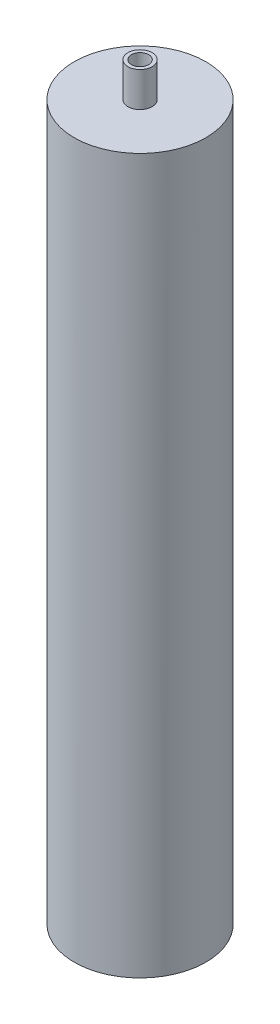
ISO-10303-21;
HEADER;
FILE_DESCRIPTION(('STEP AP214'),'2;1');
FILE_NAME('part.step','',(''),(''),'','','');
FILE_SCHEMA(('AUTOMOTIVE_DESIGN { 1 0 10303 214 1 1 1 1 }'));
ENDSEC;
DATA;
#1=APPLICATION_CONTEXT('core data for automotive mechanical design processes');
#2=APPLICATION_PROTOCOL_DEFINITION('international standard','automotive_design',2000,#1);
#3=PRODUCT_CONTEXT('',#1,'mechanical');
#4=PRODUCT('Part','Part','',(#3));
#5=PRODUCT_RELATED_PRODUCT_CATEGORY('part','',(#4));
#6=PRODUCT_DEFINITION_FORMATION('','',#4);
#7=PRODUCT_DEFINITION_CONTEXT('part definition',#1,'design');
#8=PRODUCT_DEFINITION('design','',#6,#7);
#9=PRODUCT_DEFINITION_SHAPE('','',#8);
#10=(LENGTH_UNIT() NAMED_UNIT(*) SI_UNIT(.MILLI.,.METRE.));
#11=(NAMED_UNIT(*) PLANE_ANGLE_UNIT() SI_UNIT($,.RADIAN.));
#12=(NAMED_UNIT(*) SI_UNIT($,.STERADIAN.) SOLID_ANGLE_UNIT());
#13=UNCERTAINTY_MEASURE_WITH_UNIT(LENGTH_MEASURE(1.E-05),#10,'distance_accuracy_value','');
#14=(GEOMETRIC_REPRESENTATION_CONTEXT(3) GLOBAL_UNCERTAINTY_ASSIGNED_CONTEXT((#13)) GLOBAL_UNIT_ASSIGNED_CONTEXT((#10,
#11,#12)) REPRESENTATION_CONTEXT('',''));
#15=CARTESIAN_POINT('',(0.,0.,0.));
#16=DIRECTION('',(0.,0.,1.));
#17=DIRECTION('',(1.,0.,0.));
#18=AXIS2_PLACEMENT_3D('',#15,#16,#17);
#19=CARTESIAN_POINT('',(0.,204.,0.));
#20=DIRECTION('',(0.,1.,0.));
#21=DIRECTION('',(0.,0.,1.));
#22=AXIS2_PLACEMENT_3D('',#19,#20,#21);
#23=PLANE('',#22);
#24=CARTESIAN_POINT('',(0.,204.,0.));
#25=DIRECTION('',(0.,1.,0.));
#26=DIRECTION('',(0.,0.,1.));
#27=AXIS2_PLACEMENT_3D('',#24,#25,#26);
#28=CIRCLE('',#27,19.);
#29=CARTESIAN_POINT('',(0.,204.,19.));
#30=VERTEX_POINT('',#29);
#31=EDGE_CURVE('E390',#30,#30,#28,.T.);
#32=ORIENTED_EDGE('',*,*,#31,.T.);
#33=EDGE_LOOP('',(#32));
#34=FACE_BOUND('',#33,.T.);
#35=CARTESIAN_POINT('',(0.,204.,0.));
#36=DIRECTION('',(0.,1.,0.));
#37=DIRECTION('',(0.,0.,1.));
#38=AXIS2_PLACEMENT_3D('',#35,#36,#37);
#39=CIRCLE('',#38,3.5);
#40=CARTESIAN_POINT('',(0.,204.,3.5));
#41=VERTEX_POINT('',#40);
#42=EDGE_CURVE('E378',#41,#41,#39,.T.);
#43=ORIENTED_EDGE('',*,*,#42,.F.);
#44=EDGE_LOOP('',(#43));
#45=FACE_BOUND('',#44,.T.);
#46=ADVANCED_FACE('F39',(#34,#45),#23,.T.);
#47=CARTESIAN_POINT('',(0.,152.,0.));
#48=DIRECTION('',(0.,1.,0.));
#49=DIRECTION('',(0.,0.,1.));
#50=AXIS2_PLACEMENT_3D('',#47,#48,#49);
#51=PLANE('',#50);
#52=CARTESIAN_POINT('',(0.,152.,0.));
#53=DIRECTION('',(0.,1.,0.));
#54=DIRECTION('',(0.,0.,1.));
#55=AXIS2_PLACEMENT_3D('',#52,#53,#54);
#56=CIRCLE('',#55,2.5);
#57=CARTESIAN_POINT('',(0.,152.,2.5));
#58=VERTEX_POINT('',#57);
#59=EDGE_CURVE('E398',#58,#58,#56,.T.);
#60=ORIENTED_EDGE('',*,*,#59,.F.);
#61=EDGE_LOOP('',(#60));
#62=FACE_BOUND('',#61,.T.);
#63=CARTESIAN_POINT('',(-10.,152.,0.));
#64=DIRECTION('',(0.,1.,0.));
#65=DIRECTION('',(0.,0.,1.));
#66=AXIS2_PLACEMENT_3D('',#63,#64,#65);
#67=CIRCLE('',#66,2.);
#68=CARTESIAN_POINT('',(-10.,152.,2.));
#69=VERTEX_POINT('',#68);
#70=EDGE_CURVE('E414',#69,#69,#67,.T.);
#71=ORIENTED_EDGE('',*,*,#70,.F.);
#72=EDGE_LOOP('',(#71));
#73=FACE_BOUND('',#72,.T.);
#74=DIRECTION('',(0.,0.,-1.));
#75=VECTOR('',#74,1.);
#76=CARTESIAN_POINT('',(6.2,152.,-15.61));
#77=LINE('',#76,#75);
#78=CARTESIAN_POINT('',(6.2,152.,-9.89));
#79=VERTEX_POINT('',#78);
#80=CARTESIAN_POINT('',(6.2,152.,-15.61));
#81=VERTEX_POINT('',#80);
#82=EDGE_CURVE('E100',#79,#81,#77,.T.);
#83=ORIENTED_EDGE('',*,*,#82,.F.);
#84=DIRECTION('',(1.,0.,0.));
#85=VECTOR('',#84,1.);
#86=CARTESIAN_POINT('',(6.2,152.,-9.89));
#87=LINE('',#86,#85);
#88=CARTESIAN_POINT('',(0.,152.,-9.89));
#89=VERTEX_POINT('',#88);
#90=EDGE_CURVE('E84',#89,#79,#87,.T.);
#91=ORIENTED_EDGE('',*,*,#90,.F.);
#92=DIRECTION('',(0.,0.,1.));
#93=VECTOR('',#92,1.);
#94=CARTESIAN_POINT('',(0.,152.,-9.89));
#95=LINE('',#94,#93);
#96=CARTESIAN_POINT('',(0.,152.,-15.61));
#97=VERTEX_POINT('',#96);
#98=EDGE_CURVE('E78',#97,#89,#95,.T.);
#99=ORIENTED_EDGE('',*,*,#98,.F.);
#100=DIRECTION('',(-1.,0.,0.));
#101=VECTOR('',#100,1.);
#102=CARTESIAN_POINT('',(0.,152.,-15.61));
#103=LINE('',#102,#101);
#104=EDGE_CURVE('E104',#81,#97,#103,.T.);
#105=ORIENTED_EDGE('',*,*,#104,.F.);
#106=EDGE_LOOP('',(#83,#91,#99,#105));
#107=FACE_BOUND('',#106,.T.);
#108=CARTESIAN_POINT('',(10.,152.,0.));
#109=DIRECTION('',(0.,1.,0.));
#110=DIRECTION('',(0.,0.,1.));
#111=AXIS2_PLACEMENT_3D('',#108,#109,#110);
#112=CIRCLE('',#111,2.);
#113=CARTESIAN_POINT('',(10.,152.,2.));
#114=VERTEX_POINT('',#113);
#115=EDGE_CURVE('E113',#114,#114,#112,.T.);
#116=ORIENTED_EDGE('',*,*,#115,.F.);
#117=EDGE_LOOP('',(#116));
#118=FACE_BOUND('',#117,.T.);
#119=CARTESIAN_POINT('',(0.,152.,10.));
#120=DIRECTION('',(0.,1.,0.));
#121=DIRECTION('',(0.,0.,1.));
#122=AXIS2_PLACEMENT_3D('',#119,#120,#121);
#123=CIRCLE('',#122,2.);
#124=CARTESIAN_POINT('',(0.,152.,12.));
#125=VERTEX_POINT('',#124);
#126=EDGE_CURVE('E406',#125,#125,#123,.T.);
#127=ORIENTED_EDGE('',*,*,#126,.F.);
#128=EDGE_LOOP('',(#127));
#129=FACE_BOUND('',#128,.T.);
#130=CARTESIAN_POINT('',(0.,152.,0.));
#131=DIRECTION('',(0.,1.,0.));
#132=DIRECTION('',(0.,0.,1.));
#133=AXIS2_PLACEMENT_3D('',#130,#131,#132);
#134=CIRCLE('',#133,18.);
#135=CARTESIAN_POINT('',(0.,152.,18.));
#136=VERTEX_POINT('',#135);
#137=EDGE_CURVE('E11',#136,#136,#134,.F.);
#138=ORIENTED_EDGE('',*,*,#137,.F.);
#139=EDGE_LOOP('',(#138));
#140=FACE_BOUND('',#139,.T.);
#141=ADVANCED_FACE('F98',(#62,#73,#107,#118,#129,#140),#51,.T.);
#142=CARTESIAN_POINT('',(0.,150.,0.));
#143=DIRECTION('',(0.,-1.,0.));
#144=DIRECTION('',(0.,0.,-1.));
#145=AXIS2_PLACEMENT_3D('',#142,#143,#144);
#146=CYLINDRICAL_SURFACE('',#145,19.);
#147=ORIENTED_EDGE('',*,*,#31,.F.);
#148=EDGE_LOOP('',(#147));
#149=FACE_BOUND('',#148,.T.);
#150=CARTESIAN_POINT('',(0.,-2.,0.));
#151=DIRECTION('',(0.,-1.,0.));
#152=DIRECTION('',(0.,0.,-1.));
#153=AXIS2_PLACEMENT_3D('',#150,#151,#152);
#154=CIRCLE('',#153,19.);
#155=CARTESIAN_POINT('',(0.,-2.,-19.));
#156=VERTEX_POINT('',#155);
#157=EDGE_CURVE('E368',#156,#156,#154,.T.);
#158=ORIENTED_EDGE('',*,*,#157,.F.);
#159=EDGE_LOOP('',(#158));
#160=FACE_BOUND('',#159,.T.);
#161=ADVANCED_FACE('F41',(#149,#160),#146,.T.);
#162=CARTESIAN_POINT('',(0.,150.,0.));
#163=DIRECTION('',(0.,-1.,0.));
#164=DIRECTION('',(0.,0.,-1.));
#165=AXIS2_PLACEMENT_3D('',#162,#163,#164);
#166=CYLINDRICAL_SURFACE('',#165,18.);
#167=CARTESIAN_POINT('',(0.,150.,0.));
#168=DIRECTION('',(0.,1.,0.));
#169=DIRECTION('',(0.,0.,1.));
#170=AXIS2_PLACEMENT_3D('',#167,#168,#169);
#171=CIRCLE('',#170,18.);
#172=CARTESIAN_POINT('',(0.,150.,18.));
#173=VERTEX_POINT('',#172);
#174=EDGE_CURVE('E94',#173,#173,#171,.T.);
#175=ORIENTED_EDGE('',*,*,#174,.T.);
#176=EDGE_LOOP('',(#175));
#177=FACE_BOUND('',#176,.T.);
#178=CARTESIAN_POINT('',(0.,0.,0.));
#179=DIRECTION('',(0.,1.,0.));
#180=DIRECTION('',(0.,0.,1.));
#181=AXIS2_PLACEMENT_3D('',#178,#179,#180);
#182=CIRCLE('',#181,18.);
#183=CARTESIAN_POINT('',(0.,0.,18.));
#184=VERTEX_POINT('',#183);
#185=EDGE_CURVE('E48',#184,#184,#182,.T.);
#186=ORIENTED_EDGE('',*,*,#185,.F.);
#187=EDGE_LOOP('',(#186));
#188=FACE_BOUND('',#187,.T.);
#189=ADVANCED_FACE('F138',(#177,#188),#166,.F.);
#190=CARTESIAN_POINT('',(0.,150.,0.));
#191=DIRECTION('',(0.,1.,0.));
#192=DIRECTION('',(0.,0.,1.));
#193=AXIS2_PLACEMENT_3D('',#190,#191,#192);
#194=PLANE('',#193);
#195=CARTESIAN_POINT('',(0.,150.,0.));
#196=DIRECTION('',(0.,1.,0.));
#197=DIRECTION('',(0.,0.,1.));
#198=AXIS2_PLACEMENT_3D('',#195,#196,#197);
#199=CIRCLE('',#198,2.5);
#200=CARTESIAN_POINT('',(0.,150.,2.5));
#201=VERTEX_POINT('',#200);
#202=EDGE_CURVE('E397',#201,#201,#199,.T.);
#203=ORIENTED_EDGE('',*,*,#202,.T.);
#204=EDGE_LOOP('',(#203));
#205=FACE_BOUND('',#204,.T.);
#206=CARTESIAN_POINT('',(0.,150.,10.));
#207=DIRECTION('',(0.,1.,0.));
#208=DIRECTION('',(0.,0.,1.));
#209=AXIS2_PLACEMENT_3D('',#206,#207,#208);
#210=CIRCLE('',#209,2.);
#211=CARTESIAN_POINT('',(0.,150.,12.));
#212=VERTEX_POINT('',#211);
#213=EDGE_CURVE('E402',#212,#212,#210,.T.);
#214=ORIENTED_EDGE('',*,*,#213,.T.);
#215=EDGE_LOOP('',(#214));
#216=FACE_BOUND('',#215,.T.);
#217=CARTESIAN_POINT('',(-10.,150.,0.));
#218=DIRECTION('',(0.,1.,0.));
#219=DIRECTION('',(0.,0.,1.));
#220=AXIS2_PLACEMENT_3D('',#217,#218,#219);
#221=CIRCLE('',#220,2.);
#222=CARTESIAN_POINT('',(-10.,150.,2.));
#223=VERTEX_POINT('',#222);
#224=EDGE_CURVE('E410',#223,#223,#221,.T.);
#225=ORIENTED_EDGE('',*,*,#224,.T.);
#226=EDGE_LOOP('',(#225));
#227=FACE_BOUND('',#226,.T.);
#228=CARTESIAN_POINT('',(10.,150.,0.));
#229=DIRECTION('',(0.,1.,0.));
#230=DIRECTION('',(0.,0.,1.));
#231=AXIS2_PLACEMENT_3D('',#228,#229,#230);
#232=CIRCLE('',#231,2.);
#233=CARTESIAN_POINT('',(10.,150.,2.));
#234=VERTEX_POINT('',#233);
#235=EDGE_CURVE('E418',#234,#234,#232,.T.);
#236=ORIENTED_EDGE('',*,*,#235,.T.);
#237=EDGE_LOOP('',(#236));
#238=FACE_BOUND('',#237,.T.);
#239=DIRECTION('',(1.,0.,0.));
#240=VECTOR('',#239,1.);
#241=CARTESIAN_POINT('',(6.2,150.,-9.89));
#242=LINE('',#241,#240);
#243=CARTESIAN_POINT('',(0.,150.,-9.89));
#244=VERTEX_POINT('',#243);
#245=CARTESIAN_POINT('',(6.2,150.,-9.89));
#246=VERTEX_POINT('',#245);
#247=EDGE_CURVE('E91',#244,#246,#242,.T.);
#248=ORIENTED_EDGE('',*,*,#247,.T.);
#249=DIRECTION('',(0.,0.,-1.));
#250=VECTOR('',#249,1.);
#251=CARTESIAN_POINT('',(6.2,150.,-15.61));
#252=LINE('',#251,#250);
#253=CARTESIAN_POINT('',(6.2,150.,-15.61));
#254=VERTEX_POINT('',#253);
#255=EDGE_CURVE('E112',#246,#254,#252,.T.);
#256=ORIENTED_EDGE('',*,*,#255,.T.);
#257=DIRECTION('',(-1.,0.,0.));
#258=VECTOR('',#257,1.);
#259=CARTESIAN_POINT('',(0.,150.,-15.61));
#260=LINE('',#259,#258);
#261=CARTESIAN_POINT('',(0.,150.,-15.61));
#262=VERTEX_POINT('',#261);
#263=EDGE_CURVE('E117',#254,#262,#260,.T.);
#264=ORIENTED_EDGE('',*,*,#263,.T.);
#265=DIRECTION('',(0.,0.,1.));
#266=VECTOR('',#265,1.);
#267=CARTESIAN_POINT('',(0.,150.,-10.));
#268=LINE('',#267,#266);
#269=EDGE_CURVE('E85',#262,#244,#268,.T.);
#270=ORIENTED_EDGE('',*,*,#269,.T.);
#271=EDGE_LOOP('',(#248,#256,#264,#270));
#272=FACE_BOUND('',#271,.T.);
#273=ORIENTED_EDGE('',*,*,#174,.F.);
#274=EDGE_LOOP('',(#273));
#275=FACE_BOUND('',#274,.T.);
#276=ADVANCED_FACE('F140',(#205,#216,#227,#238,#272,#275),#194,.F.);
#277=CARTESIAN_POINT('',(6.2,152.,-9.89));
#278=DIRECTION('',(0.,0.,-1.));
#279=DIRECTION('',(-1.,0.,0.));
#280=AXIS2_PLACEMENT_3D('',#277,#278,#279);
#281=PLANE('',#280);
#282=ORIENTED_EDGE('',*,*,#247,.F.);
#283=DIRECTION('',(0.,-1.,0.));
#284=VECTOR('',#283,1.);
#285=CARTESIAN_POINT('',(0.,152.,-9.89));
#286=LINE('',#285,#284);
#287=EDGE_CURVE('E60',#89,#244,#286,.T.);
#288=ORIENTED_EDGE('',*,*,#287,.F.);
#289=ORIENTED_EDGE('',*,*,#90,.T.);
#290=DIRECTION('',(0.,-1.,0.));
#291=VECTOR('',#290,1.);
#292=CARTESIAN_POINT('',(6.2,152.,-9.89));
#293=LINE('',#292,#291);
#294=EDGE_CURVE('E95',#79,#246,#293,.T.);
#295=ORIENTED_EDGE('',*,*,#294,.T.);
#296=EDGE_LOOP('',(#282,#288,#289,#295));
#297=FACE_BOUND('',#296,.T.);
#298=ADVANCED_FACE('F88',(#297),#281,.T.);
#299=CARTESIAN_POINT('',(6.2,152.,-15.61));
#300=DIRECTION('',(-1.,0.,0.));
#301=DIRECTION('',(0.,0.,1.));
#302=AXIS2_PLACEMENT_3D('',#299,#300,#301);
#303=PLANE('',#302);
#304=ORIENTED_EDGE('',*,*,#255,.F.);
#305=ORIENTED_EDGE('',*,*,#294,.F.);
#306=ORIENTED_EDGE('',*,*,#82,.T.);
#307=DIRECTION('',(0.,-1.,0.));
#308=VECTOR('',#307,1.);
#309=CARTESIAN_POINT('',(6.2,152.,-15.61));
#310=LINE('',#309,#308);
#311=EDGE_CURVE('E125',#81,#254,#310,.T.);
#312=ORIENTED_EDGE('',*,*,#311,.T.);
#313=EDGE_LOOP('',(#304,#305,#306,#312));
#314=FACE_BOUND('',#313,.T.);
#315=ADVANCED_FACE('F192',(#314),#303,.T.);
#316=CARTESIAN_POINT('',(0.,152.,-15.61));
#317=DIRECTION('',(0.,0.,1.));
#318=DIRECTION('',(1.,0.,0.));
#319=AXIS2_PLACEMENT_3D('',#316,#317,#318);
#320=PLANE('',#319);
#321=ORIENTED_EDGE('',*,*,#263,.F.);
#322=ORIENTED_EDGE('',*,*,#311,.F.);
#323=ORIENTED_EDGE('',*,*,#104,.T.);
#324=DIRECTION('',(0.,-1.,0.));
#325=VECTOR('',#324,1.);
#326=CARTESIAN_POINT('',(0.,152.,-15.61));
#327=LINE('',#326,#325);
#328=EDGE_CURVE('E55',#97,#262,#327,.T.);
#329=ORIENTED_EDGE('',*,*,#328,.T.);
#330=EDGE_LOOP('',(#321,#322,#323,#329));
#331=FACE_BOUND('',#330,.T.);
#332=ADVANCED_FACE('F189',(#331),#320,.T.);
#333=CARTESIAN_POINT('',(0.,152.,-10.));
#334=DIRECTION('',(1.,0.,0.));
#335=DIRECTION('',(0.,0.,-1.));
#336=AXIS2_PLACEMENT_3D('',#333,#334,#335);
#337=PLANE('',#336);
#338=ORIENTED_EDGE('',*,*,#269,.F.);
#339=ORIENTED_EDGE('',*,*,#328,.F.);
#340=ORIENTED_EDGE('',*,*,#98,.T.);
#341=ORIENTED_EDGE('',*,*,#287,.T.);
#342=EDGE_LOOP('',(#338,#339,#340,#341));
#343=FACE_BOUND('',#342,.T.);
#344=ADVANCED_FACE('F79',(#343),#337,.T.);
#345=CARTESIAN_POINT('',(10.,152.,0.));
#346=DIRECTION('',(0.,-1.,0.));
#347=DIRECTION('',(0.,0.,-1.));
#348=AXIS2_PLACEMENT_3D('',#345,#346,#347);
#349=CYLINDRICAL_SURFACE('',#348,2.);
#350=ORIENTED_EDGE('',*,*,#115,.T.);
#351=EDGE_LOOP('',(#350));
#352=FACE_BOUND('',#351,.T.);
#353=ORIENTED_EDGE('',*,*,#235,.F.);
#354=EDGE_LOOP('',(#353));
#355=FACE_BOUND('',#354,.T.);
#356=ADVANCED_FACE('F182',(#352,#355),#349,.F.);
#357=CARTESIAN_POINT('',(-10.,152.,0.));
#358=DIRECTION('',(0.,-1.,0.));
#359=DIRECTION('',(0.,0.,-1.));
#360=AXIS2_PLACEMENT_3D('',#357,#358,#359);
#361=CYLINDRICAL_SURFACE('',#360,2.);
#362=ORIENTED_EDGE('',*,*,#70,.T.);
#363=EDGE_LOOP('',(#362));
#364=FACE_BOUND('',#363,.T.);
#365=ORIENTED_EDGE('',*,*,#224,.F.);
#366=EDGE_LOOP('',(#365));
#367=FACE_BOUND('',#366,.T.);
#368=ADVANCED_FACE('F178',(#364,#367),#361,.F.);
#369=CARTESIAN_POINT('',(0.,152.,10.));
#370=DIRECTION('',(0.,-1.,0.));
#371=DIRECTION('',(0.,0.,-1.));
#372=AXIS2_PLACEMENT_3D('',#369,#370,#371);
#373=CYLINDRICAL_SURFACE('',#372,2.);
#374=ORIENTED_EDGE('',*,*,#126,.T.);
#375=EDGE_LOOP('',(#374));
#376=FACE_BOUND('',#375,.T.);
#377=ORIENTED_EDGE('',*,*,#213,.F.);
#378=EDGE_LOOP('',(#377));
#379=FACE_BOUND('',#378,.T.);
#380=ADVANCED_FACE('F174',(#376,#379),#373,.F.);
#381=CARTESIAN_POINT('',(0.,152.,0.));
#382=DIRECTION('',(0.,-1.,0.));
#383=DIRECTION('',(0.,0.,-1.));
#384=AXIS2_PLACEMENT_3D('',#381,#382,#383);
#385=CYLINDRICAL_SURFACE('',#384,2.5);
#386=ORIENTED_EDGE('',*,*,#59,.T.);
#387=EDGE_LOOP('',(#386));
#388=FACE_BOUND('',#387,.T.);
#389=ORIENTED_EDGE('',*,*,#202,.F.);
#390=EDGE_LOOP('',(#389));
#391=FACE_BOUND('',#390,.T.);
#392=ADVANCED_FACE('F170',(#388,#391),#385,.F.);
#393=CARTESIAN_POINT('',(0.,202.,0.));
#394=DIRECTION('',(0.,-1.,0.));
#395=DIRECTION('',(0.,0.,-1.));
#396=AXIS2_PLACEMENT_3D('',#393,#394,#395);
#397=CYLINDRICAL_SURFACE('',#396,18.);
#398=CARTESIAN_POINT('',(0.,202.,0.));
#399=DIRECTION('',(0.,1.,0.));
#400=DIRECTION('',(0.,0.,1.));
#401=AXIS2_PLACEMENT_3D('',#398,#399,#400);
#402=CIRCLE('',#401,18.);
#403=CARTESIAN_POINT('',(0.,202.,18.));
#404=VERTEX_POINT('',#403);
#405=EDGE_CURVE('E393',#404,#404,#402,.T.);
#406=ORIENTED_EDGE('',*,*,#405,.T.);
#407=EDGE_LOOP('',(#406));
#408=FACE_BOUND('',#407,.T.);
#409=ORIENTED_EDGE('',*,*,#137,.T.);
#410=EDGE_LOOP('',(#409));
#411=FACE_BOUND('',#410,.T.);
#412=ADVANCED_FACE('F166',(#408,#411),#397,.F.);
#413=CARTESIAN_POINT('',(0.,202.,0.));
#414=DIRECTION('',(0.,1.,0.));
#415=DIRECTION('',(0.,0.,1.));
#416=AXIS2_PLACEMENT_3D('',#413,#414,#415);
#417=PLANE('',#416);
#418=CARTESIAN_POINT('',(0.,202.,0.));
#419=DIRECTION('',(0.,1.,0.));
#420=DIRECTION('',(0.,0.,1.));
#421=AXIS2_PLACEMENT_3D('',#418,#419,#420);
#422=CIRCLE('',#421,2.5);
#423=CARTESIAN_POINT('',(0.,202.,2.5));
#424=VERTEX_POINT('',#423);
#425=EDGE_CURVE('E383',#424,#424,#422,.T.);
#426=ORIENTED_EDGE('',*,*,#425,.T.);
#427=EDGE_LOOP('',(#426));
#428=FACE_BOUND('',#427,.T.);
#429=ORIENTED_EDGE('',*,*,#405,.F.);
#430=EDGE_LOOP('',(#429));
#431=FACE_BOUND('',#430,.T.);
#432=ADVANCED_FACE('F163',(#428,#431),#417,.F.);
#433=CARTESIAN_POINT('',(0.,204.,0.));
#434=DIRECTION('',(0.,-1.,0.));
#435=DIRECTION('',(0.,0.,-1.));
#436=AXIS2_PLACEMENT_3D('',#433,#434,#435);
#437=CYLINDRICAL_SURFACE('',#436,2.5);
#438=ORIENTED_EDGE('',*,*,#425,.F.);
#439=EDGE_LOOP('',(#438));
#440=FACE_BOUND('',#439,.T.);
#441=CARTESIAN_POINT('',(0.,214.,0.));
#442=DIRECTION('',(0.,1.,0.));
#443=DIRECTION('',(0.,0.,1.));
#444=AXIS2_PLACEMENT_3D('',#441,#442,#443);
#445=CIRCLE('',#444,2.5);
#446=CARTESIAN_POINT('',(0.,214.,2.5));
#447=VERTEX_POINT('',#446);
#448=EDGE_CURVE('E374',#447,#447,#445,.T.);
#449=ORIENTED_EDGE('',*,*,#448,.T.);
#450=EDGE_LOOP('',(#449));
#451=FACE_BOUND('',#450,.T.);
#452=ADVANCED_FACE('F161',(#440,#451),#437,.F.);
#453=CARTESIAN_POINT('',(0.,214.,0.));
#454=DIRECTION('',(0.,1.,0.));
#455=DIRECTION('',(0.,0.,1.));
#456=AXIS2_PLACEMENT_3D('',#453,#454,#455);
#457=PLANE('',#456);
#458=CARTESIAN_POINT('',(0.,214.,0.));
#459=DIRECTION('',(0.,1.,0.));
#460=DIRECTION('',(0.,0.,1.));
#461=AXIS2_PLACEMENT_3D('',#458,#459,#460);
#462=CIRCLE('',#461,3.5);
#463=CARTESIAN_POINT('',(0.,214.,3.5));
#464=VERTEX_POINT('',#463);
#465=EDGE_CURVE('E379',#464,#464,#462,.T.);
#466=ORIENTED_EDGE('',*,*,#465,.T.);
#467=EDGE_LOOP('',(#466));
#468=FACE_BOUND('',#467,.T.);
#469=ORIENTED_EDGE('',*,*,#448,.F.);
#470=EDGE_LOOP('',(#469));
#471=FACE_BOUND('',#470,.T.);
#472=ADVANCED_FACE('F245',(#468,#471),#457,.T.);
#473=CARTESIAN_POINT('',(0.,214.,0.));
#474=DIRECTION('',(0.,-1.,0.));
#475=DIRECTION('',(0.,0.,-1.));
#476=AXIS2_PLACEMENT_3D('',#473,#474,#475);
#477=CYLINDRICAL_SURFACE('',#476,3.5);
#478=ORIENTED_EDGE('',*,*,#465,.F.);
#479=EDGE_LOOP('',(#478));
#480=FACE_BOUND('',#479,.T.);
#481=ORIENTED_EDGE('',*,*,#42,.T.);
#482=EDGE_LOOP('',(#481));
#483=FACE_BOUND('',#482,.T.);
#484=ADVANCED_FACE('F252',(#480,#483),#477,.T.);
#485=CARTESIAN_POINT('',(0.,0.,0.));
#486=DIRECTION('',(0.,-1.,0.));
#487=DIRECTION('',(0.,0.,-1.));
#488=AXIS2_PLACEMENT_3D('',#485,#486,#487);
#489=PLANE('',#488);
#490=CARTESIAN_POINT('',(0.,0.,0.));
#491=DIRECTION('',(0.,-1.,0.));
#492=DIRECTION('',(0.,0.,-1.));
#493=AXIS2_PLACEMENT_3D('',#490,#491,#492);
#494=CIRCLE('',#493,12.5);
#495=CARTESIAN_POINT('',(0.,0.,-12.5));
#496=VERTEX_POINT('',#495);
#497=EDGE_CURVE('E364',#496,#496,#494,.T.);
#498=ORIENTED_EDGE('',*,*,#497,.T.);
#499=EDGE_LOOP('',(#498));
#500=FACE_BOUND('',#499,.T.);
#501=ORIENTED_EDGE('',*,*,#185,.T.);
#502=EDGE_LOOP('',(#501));
#503=FACE_BOUND('',#502,.T.);
#504=ADVANCED_FACE('F136',(#500,#503),#489,.F.);
#505=CARTESIAN_POINT('',(0.,-2.,0.));
#506=DIRECTION('',(0.,-1.,0.));
#507=DIRECTION('',(0.,0.,-1.));
#508=AXIS2_PLACEMENT_3D('',#505,#506,#507);
#509=PLANE('',#508);
#510=ORIENTED_EDGE('',*,*,#157,.T.);
#511=EDGE_LOOP('',(#510));
#512=FACE_BOUND('',#511,.T.);
#513=CARTESIAN_POINT('',(0.,-2.,0.));
#514=DIRECTION('',(0.,-1.,0.));
#515=DIRECTION('',(0.,0.,-1.));
#516=AXIS2_PLACEMENT_3D('',#513,#514,#515);
#517=CIRCLE('',#516,12.5);
#518=CARTESIAN_POINT('',(0.,-2.,-12.5));
#519=VERTEX_POINT('',#518);
#520=EDGE_CURVE('E361',#519,#519,#517,.T.);
#521=ORIENTED_EDGE('',*,*,#520,.F.);
#522=EDGE_LOOP('',(#521));
#523=FACE_BOUND('',#522,.T.);
#524=ADVANCED_FACE('F267',(#512,#523),#509,.T.);
#525=CARTESIAN_POINT('',(0.,-2.,0.));
#526=DIRECTION('',(0.,1.,0.));
#527=DIRECTION('',(0.,0.,1.));
#528=AXIS2_PLACEMENT_3D('',#525,#526,#527);
#529=CYLINDRICAL_SURFACE('',#528,12.5);
#530=ORIENTED_EDGE('',*,*,#520,.T.);
#531=EDGE_LOOP('',(#530));
#532=FACE_BOUND('',#531,.T.);
#533=ORIENTED_EDGE('',*,*,#497,.F.);
#534=EDGE_LOOP('',(#533));
#535=FACE_BOUND('',#534,.T.);
#536=ADVANCED_FACE('F275',(#532,#535),#529,.F.);
#537=CLOSED_SHELL('',(#46,#141,#161,#189,#276,#298,#315,#332,#344,#356,#368,#380,#392,#412,#432,
#452,#472,#484,#504,#524,#536));
#538=MANIFOLD_SOLID_BREP('B2',#537);
#539=ADVANCED_BREP_SHAPE_REPRESENTATION('',(#18,#538),#14);
#540=SHAPE_DEFINITION_REPRESENTATION(#9,#539);
ENDSEC;
END-ISO-10303-21;
